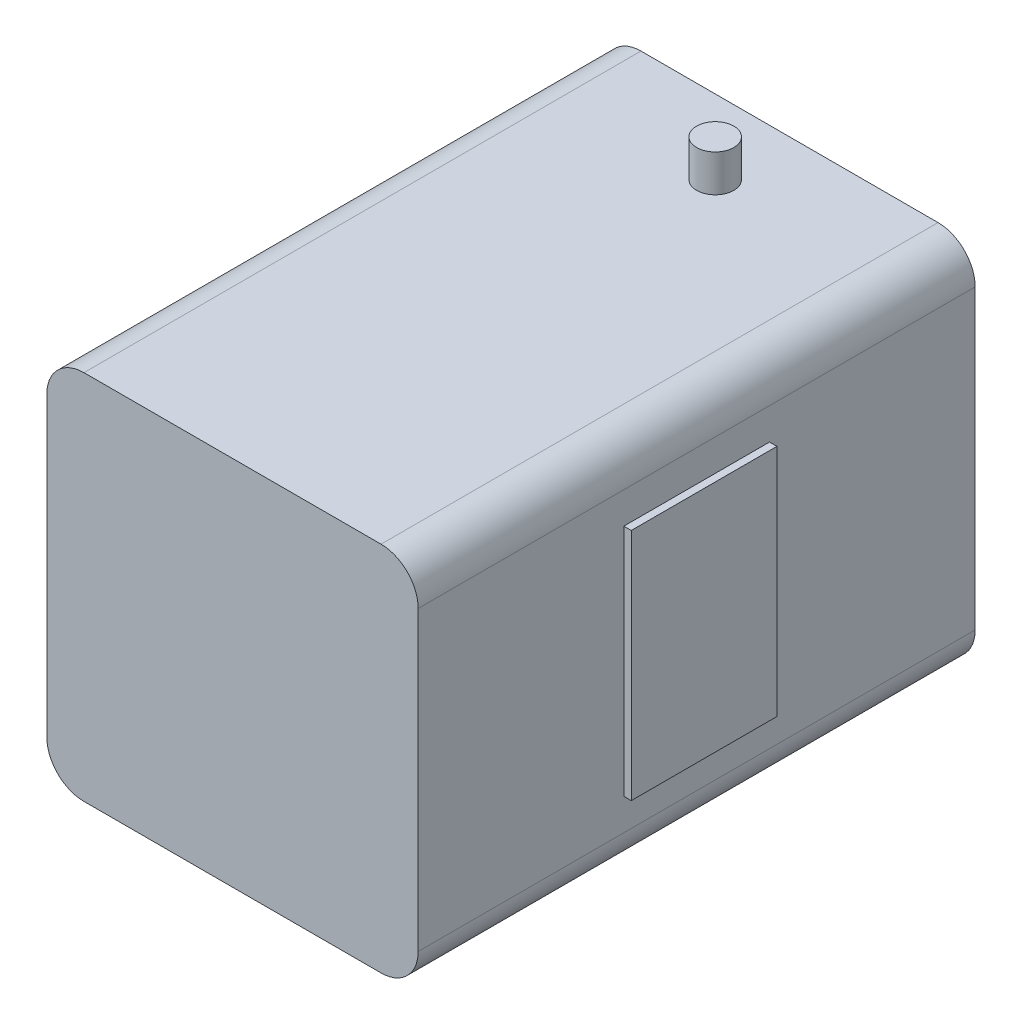
ISO-10303-21;
HEADER;
FILE_DESCRIPTION(('STEP AP214'),'2;1');
FILE_NAME('part.step','',(''),(''),'','','');
FILE_SCHEMA(('AUTOMOTIVE_DESIGN { 1 0 10303 214 1 1 1 1 }'));
ENDSEC;
DATA;
#1=APPLICATION_CONTEXT('core data for automotive mechanical design processes');
#2=APPLICATION_PROTOCOL_DEFINITION('international standard','automotive_design',2000,#1);
#3=PRODUCT_CONTEXT('',#1,'mechanical');
#4=PRODUCT('Part','Part','',(#3));
#5=PRODUCT_RELATED_PRODUCT_CATEGORY('part','',(#4));
#6=PRODUCT_DEFINITION_FORMATION('','',#4);
#7=PRODUCT_DEFINITION_CONTEXT('part definition',#1,'design');
#8=PRODUCT_DEFINITION('design','',#6,#7);
#9=PRODUCT_DEFINITION_SHAPE('','',#8);
#10=(LENGTH_UNIT() NAMED_UNIT(*) SI_UNIT(.MILLI.,.METRE.));
#11=(NAMED_UNIT(*) PLANE_ANGLE_UNIT() SI_UNIT($,.RADIAN.));
#12=(NAMED_UNIT(*) SI_UNIT($,.STERADIAN.) SOLID_ANGLE_UNIT());
#13=UNCERTAINTY_MEASURE_WITH_UNIT(LENGTH_MEASURE(1.E-05),#10,'distance_accuracy_value','');
#14=(GEOMETRIC_REPRESENTATION_CONTEXT(3) GLOBAL_UNCERTAINTY_ASSIGNED_CONTEXT((#13)) GLOBAL_UNIT_ASSIGNED_CONTEXT((#10,
#11,#12)) REPRESENTATION_CONTEXT('',''));
#15=CARTESIAN_POINT('',(0.,0.,0.));
#16=DIRECTION('',(0.,0.,1.));
#17=DIRECTION('',(1.,0.,0.));
#18=AXIS2_PLACEMENT_3D('',#15,#16,#17);
#19=CARTESIAN_POINT('',(50.,-50.,150.));
#20=DIRECTION('',(-1.,0.,0.));
#21=DIRECTION('',(0.,0.,1.));
#22=AXIS2_PLACEMENT_3D('',#19,#20,#21);
#23=PLANE('',#22);
#24=DIRECTION('',(0.,1.,0.));
#25=VECTOR('',#24,1.);
#26=CARTESIAN_POINT('',(50.,-50.,0.));
#27=LINE('',#26,#25);
#28=CARTESIAN_POINT('',(50.,-40.,0.));
#29=VERTEX_POINT('',#28);
#30=CARTESIAN_POINT('',(50.,40.,0.));
#31=VERTEX_POINT('',#30);
#32=EDGE_CURVE('E147',#29,#31,#27,.T.);
#33=ORIENTED_EDGE('',*,*,#32,.T.);
#34=DIRECTION('',(0.,0.,-1.));
#35=VECTOR('',#34,1.);
#36=CARTESIAN_POINT('',(50.,40.,150.));
#37=LINE('',#36,#35);
#38=CARTESIAN_POINT('',(50.,40.,150.));
#39=VERTEX_POINT('',#38);
#40=EDGE_CURVE('E205',#31,#39,#37,.F.);
#41=ORIENTED_EDGE('',*,*,#40,.T.);
#42=DIRECTION('',(0.,1.,0.));
#43=VECTOR('',#42,1.);
#44=CARTESIAN_POINT('',(50.,-50.,150.));
#45=LINE('',#44,#43);
#46=CARTESIAN_POINT('',(50.,-40.,150.));
#47=VERTEX_POINT('',#46);
#48=EDGE_CURVE('E156',#47,#39,#45,.T.);
#49=ORIENTED_EDGE('',*,*,#48,.F.);
#50=DIRECTION('',(0.,0.,-1.));
#51=VECTOR('',#50,1.);
#52=CARTESIAN_POINT('',(50.,-40.,150.));
#53=LINE('',#52,#51);
#54=EDGE_CURVE('E202',#47,#29,#53,.T.);
#55=ORIENTED_EDGE('',*,*,#54,.T.);
#56=EDGE_LOOP('',(#33,#41,#49,#55));
#57=FACE_BOUND('',#56,.T.);
#58=DIRECTION('',(0.,-1.,0.));
#59=VECTOR('',#58,1.);
#60=CARTESIAN_POINT('',(50.,-31.5036686170713,94.6154917804404));
#61=LINE('',#60,#59);
#62=CARTESIAN_POINT('',(50.,31.5036686170713,94.6154917804404));
#63=VERTEX_POINT('',#62);
#64=CARTESIAN_POINT('',(50.,-31.5036686170713,94.6154917804404));
#65=VERTEX_POINT('',#64);
#66=EDGE_CURVE('E146',#63,#65,#61,.T.);
#67=ORIENTED_EDGE('',*,*,#66,.F.);
#68=DIRECTION('',(0.,0.,1.));
#69=VECTOR('',#68,1.);
#70=CARTESIAN_POINT('',(50.,31.5036686170713,55.3845082195596));
#71=LINE('',#70,#69);
#72=CARTESIAN_POINT('',(50.,31.5036686170713,55.3845082195596));
#73=VERTEX_POINT('',#72);
#74=EDGE_CURVE('E143',#73,#63,#71,.T.);
#75=ORIENTED_EDGE('',*,*,#74,.F.);
#76=DIRECTION('',(0.,1.,0.));
#77=VECTOR('',#76,1.);
#78=CARTESIAN_POINT('',(50.,-31.5036686170713,55.3845082195596));
#79=LINE('',#78,#77);
#80=CARTESIAN_POINT('',(50.,-31.5036686170713,55.3845082195596));
#81=VERTEX_POINT('',#80);
#82=EDGE_CURVE('E58',#81,#73,#79,.T.);
#83=ORIENTED_EDGE('',*,*,#82,.F.);
#84=DIRECTION('',(0.,0.,-1.));
#85=VECTOR('',#84,1.);
#86=CARTESIAN_POINT('',(50.,-31.5036686170713,55.3845082195596));
#87=LINE('',#86,#85);
#88=EDGE_CURVE('E53',#65,#81,#87,.T.);
#89=ORIENTED_EDGE('',*,*,#88,.F.);
#90=EDGE_LOOP('',(#67,#75,#83,#89));
#91=FACE_BOUND('',#90,.T.);
#92=ADVANCED_FACE('F37',(#57,#91),#23,.F.);
#93=CARTESIAN_POINT('',(-50.,50.,150.));
#94=DIRECTION('',(0.,-1.,0.));
#95=DIRECTION('',(0.,0.,-1.));
#96=AXIS2_PLACEMENT_3D('',#93,#94,#95);
#97=PLANE('',#96);
#98=CARTESIAN_POINT('',(0.,50.,20.));
#99=DIRECTION('',(0.,-1.,0.));
#100=DIRECTION('',(0.,0.,-1.));
#101=AXIS2_PLACEMENT_3D('',#98,#99,#100);
#102=CIRCLE('',#101,5.);
#103=CARTESIAN_POINT('',(0.,50.,15.));
#104=VERTEX_POINT('',#103);
#105=EDGE_CURVE('E451',#104,#104,#102,.T.);
#106=ORIENTED_EDGE('',*,*,#105,.T.);
#107=EDGE_LOOP('',(#106));
#108=FACE_BOUND('',#107,.T.);
#109=DIRECTION('',(-1.,0.,0.));
#110=VECTOR('',#109,1.);
#111=CARTESIAN_POINT('',(-50.,50.,0.));
#112=LINE('',#111,#110);
#113=CARTESIAN_POINT('',(40.,50.,0.));
#114=VERTEX_POINT('',#113);
#115=CARTESIAN_POINT('',(-40.,50.,0.));
#116=VERTEX_POINT('',#115);
#117=EDGE_CURVE('E150',#114,#116,#112,.T.);
#118=ORIENTED_EDGE('',*,*,#117,.T.);
#119=DIRECTION('',(0.,0.,-1.));
#120=VECTOR('',#119,1.);
#121=CARTESIAN_POINT('',(-40.,50.,150.));
#122=LINE('',#121,#120);
#123=CARTESIAN_POINT('',(-40.,50.,150.));
#124=VERTEX_POINT('',#123);
#125=EDGE_CURVE('E192',#116,#124,#122,.F.);
#126=ORIENTED_EDGE('',*,*,#125,.T.);
#127=DIRECTION('',(-1.,0.,0.));
#128=VECTOR('',#127,1.);
#129=CARTESIAN_POINT('',(-50.,50.,150.));
#130=LINE('',#129,#128);
#131=CARTESIAN_POINT('',(40.,50.,150.));
#132=VERTEX_POINT('',#131);
#133=EDGE_CURVE('E159',#132,#124,#130,.T.);
#134=ORIENTED_EDGE('',*,*,#133,.F.);
#135=DIRECTION('',(0.,0.,-1.));
#136=VECTOR('',#135,1.);
#137=CARTESIAN_POINT('',(40.,50.,150.));
#138=LINE('',#137,#136);
#139=EDGE_CURVE('E189',#132,#114,#138,.T.);
#140=ORIENTED_EDGE('',*,*,#139,.T.);
#141=EDGE_LOOP('',(#118,#126,#134,#140));
#142=FACE_BOUND('',#141,.T.);
#143=ADVANCED_FACE('F236',(#108,#142),#97,.F.);
#144=CARTESIAN_POINT('',(-50.,-50.,150.));
#145=DIRECTION('',(1.,0.,0.));
#146=DIRECTION('',(0.,0.,-1.));
#147=AXIS2_PLACEMENT_3D('',#144,#145,#146);
#148=PLANE('',#147);
#149=DIRECTION('',(0.,-1.,0.));
#150=VECTOR('',#149,1.);
#151=CARTESIAN_POINT('',(-50.,-50.,150.));
#152=LINE('',#151,#150);
#153=CARTESIAN_POINT('',(-50.,40.,150.));
#154=VERTEX_POINT('',#153);
#155=CARTESIAN_POINT('',(-50.,-40.,150.));
#156=VERTEX_POINT('',#155);
#157=EDGE_CURVE('E163',#154,#156,#152,.T.);
#158=ORIENTED_EDGE('',*,*,#157,.F.);
#159=DIRECTION('',(0.,0.,-1.));
#160=VECTOR('',#159,1.);
#161=CARTESIAN_POINT('',(-50.,40.,150.));
#162=LINE('',#161,#160);
#163=CARTESIAN_POINT('',(-50.,40.,0.));
#164=VERTEX_POINT('',#163);
#165=EDGE_CURVE('E178',#154,#164,#162,.T.);
#166=ORIENTED_EDGE('',*,*,#165,.T.);
#167=DIRECTION('',(0.,-1.,0.));
#168=VECTOR('',#167,1.);
#169=CARTESIAN_POINT('',(-50.,-50.,0.));
#170=LINE('',#169,#168);
#171=CARTESIAN_POINT('',(-50.,-40.,0.));
#172=VERTEX_POINT('',#171);
#173=EDGE_CURVE('E172',#164,#172,#170,.T.);
#174=ORIENTED_EDGE('',*,*,#173,.T.);
#175=DIRECTION('',(0.,0.,-1.));
#176=VECTOR('',#175,1.);
#177=CARTESIAN_POINT('',(-50.,-40.,150.));
#178=LINE('',#177,#176);
#179=EDGE_CURVE('E168',#172,#156,#178,.F.);
#180=ORIENTED_EDGE('',*,*,#179,.T.);
#181=EDGE_LOOP('',(#158,#166,#174,#180));
#182=FACE_BOUND('',#181,.T.);
#183=ADVANCED_FACE('F244',(#182),#148,.F.);
#184=CARTESIAN_POINT('',(-50.,-50.,150.));
#185=DIRECTION('',(0.,1.,0.));
#186=DIRECTION('',(0.,0.,1.));
#187=AXIS2_PLACEMENT_3D('',#184,#185,#186);
#188=PLANE('',#187);
#189=CARTESIAN_POINT('',(0.,-50.,20.));
#190=DIRECTION('',(0.,1.,0.));
#191=DIRECTION('',(0.,0.,1.));
#192=AXIS2_PLACEMENT_3D('',#189,#190,#191);
#193=CIRCLE('',#192,5.);
#194=CARTESIAN_POINT('',(0.,-50.,25.));
#195=VERTEX_POINT('',#194);
#196=EDGE_CURVE('E41',#195,#195,#193,.T.);
#197=ORIENTED_EDGE('',*,*,#196,.T.);
#198=EDGE_LOOP('',(#197));
#199=FACE_BOUND('',#198,.T.);
#200=DIRECTION('',(1.,0.,0.));
#201=VECTOR('',#200,1.);
#202=CARTESIAN_POINT('',(-50.,-50.,0.));
#203=LINE('',#202,#201);
#204=CARTESIAN_POINT('',(-40.,-50.,0.));
#205=VERTEX_POINT('',#204);
#206=CARTESIAN_POINT('',(40.,-50.,0.));
#207=VERTEX_POINT('',#206);
#208=EDGE_CURVE('E160',#205,#207,#203,.T.);
#209=ORIENTED_EDGE('',*,*,#208,.T.);
#210=DIRECTION('',(0.,0.,-1.));
#211=VECTOR('',#210,1.);
#212=CARTESIAN_POINT('',(40.,-50.,150.));
#213=LINE('',#212,#211);
#214=CARTESIAN_POINT('',(40.,-50.,150.));
#215=VERTEX_POINT('',#214);
#216=EDGE_CURVE('E11',#207,#215,#213,.F.);
#217=ORIENTED_EDGE('',*,*,#216,.T.);
#218=DIRECTION('',(1.,0.,0.));
#219=VECTOR('',#218,1.);
#220=CARTESIAN_POINT('',(-50.,-50.,150.));
#221=LINE('',#220,#219);
#222=CARTESIAN_POINT('',(-40.,-50.,150.));
#223=VERTEX_POINT('',#222);
#224=EDGE_CURVE('E166',#223,#215,#221,.T.);
#225=ORIENTED_EDGE('',*,*,#224,.F.);
#226=DIRECTION('',(0.,0.,-1.));
#227=VECTOR('',#226,1.);
#228=CARTESIAN_POINT('',(-40.,-50.,150.));
#229=LINE('',#228,#227);
#230=EDGE_CURVE('E46',#223,#205,#229,.T.);
#231=ORIENTED_EDGE('',*,*,#230,.T.);
#232=EDGE_LOOP('',(#209,#217,#225,#231));
#233=FACE_BOUND('',#232,.T.);
#234=ADVANCED_FACE('F212',(#199,#233),#188,.F.);
#235=CARTESIAN_POINT('',(0.,0.,150.));
#236=DIRECTION('',(0.,0.,-1.));
#237=DIRECTION('',(-1.,0.,0.));
#238=AXIS2_PLACEMENT_3D('',#235,#236,#237);
#239=PLANE('',#238);
#240=ORIENTED_EDGE('',*,*,#133,.T.);
#241=CARTESIAN_POINT('',(-40.,40.,150.));
#242=DIRECTION('',(0.,0.,-1.));
#243=DIRECTION('',(-1.,0.,0.));
#244=AXIS2_PLACEMENT_3D('',#241,#242,#243);
#245=CIRCLE('',#244,10.);
#246=EDGE_CURVE('E200',#124,#154,#245,.F.);
#247=ORIENTED_EDGE('',*,*,#246,.T.);
#248=ORIENTED_EDGE('',*,*,#157,.T.);
#249=CARTESIAN_POINT('',(-40.,-40.,150.));
#250=DIRECTION('',(0.,0.,-1.));
#251=DIRECTION('',(-1.,0.,0.));
#252=AXIS2_PLACEMENT_3D('',#249,#250,#251);
#253=CIRCLE('',#252,10.);
#254=EDGE_CURVE('E194',#156,#223,#253,.F.);
#255=ORIENTED_EDGE('',*,*,#254,.T.);
#256=ORIENTED_EDGE('',*,*,#224,.T.);
#257=CARTESIAN_POINT('',(40.,-40.,150.));
#258=DIRECTION('',(0.,0.,-1.));
#259=DIRECTION('',(-1.,0.,0.));
#260=AXIS2_PLACEMENT_3D('',#257,#258,#259);
#261=CIRCLE('',#260,10.);
#262=EDGE_CURVE('E196',#215,#47,#261,.F.);
#263=ORIENTED_EDGE('',*,*,#262,.T.);
#264=ORIENTED_EDGE('',*,*,#48,.T.);
#265=CARTESIAN_POINT('',(40.,40.,150.));
#266=DIRECTION('',(0.,0.,-1.));
#267=DIRECTION('',(-1.,0.,0.));
#268=AXIS2_PLACEMENT_3D('',#265,#266,#267);
#269=CIRCLE('',#268,10.);
#270=EDGE_CURVE('E198',#39,#132,#269,.F.);
#271=ORIENTED_EDGE('',*,*,#270,.T.);
#272=EDGE_LOOP('',(#240,#247,#248,#255,#256,#263,#264,#271));
#273=FACE_BOUND('',#272,.T.);
#274=ADVANCED_FACE('F229',(#273),#239,.F.);
#275=CARTESIAN_POINT('',(0.,0.,0.));
#276=DIRECTION('',(0.,0.,-1.));
#277=DIRECTION('',(-1.,0.,0.));
#278=AXIS2_PLACEMENT_3D('',#275,#276,#277);
#279=PLANE('',#278);
#280=ORIENTED_EDGE('',*,*,#173,.F.);
#281=CARTESIAN_POINT('',(-40.,40.,0.));
#282=DIRECTION('',(0.,0.,-1.));
#283=DIRECTION('',(-1.,0.,0.));
#284=AXIS2_PLACEMENT_3D('',#281,#282,#283);
#285=CIRCLE('',#284,10.);
#286=EDGE_CURVE('E187',#164,#116,#285,.T.);
#287=ORIENTED_EDGE('',*,*,#286,.T.);
#288=ORIENTED_EDGE('',*,*,#117,.F.);
#289=CARTESIAN_POINT('',(40.,40.,0.));
#290=DIRECTION('',(0.,0.,-1.));
#291=DIRECTION('',(-1.,0.,0.));
#292=AXIS2_PLACEMENT_3D('',#289,#290,#291);
#293=CIRCLE('',#292,10.);
#294=EDGE_CURVE('E185',#114,#31,#293,.T.);
#295=ORIENTED_EDGE('',*,*,#294,.T.);
#296=ORIENTED_EDGE('',*,*,#32,.F.);
#297=CARTESIAN_POINT('',(40.,-40.,0.));
#298=DIRECTION('',(0.,0.,-1.));
#299=DIRECTION('',(-1.,0.,0.));
#300=AXIS2_PLACEMENT_3D('',#297,#298,#299);
#301=CIRCLE('',#300,10.);
#302=EDGE_CURVE('E183',#29,#207,#301,.T.);
#303=ORIENTED_EDGE('',*,*,#302,.T.);
#304=ORIENTED_EDGE('',*,*,#208,.F.);
#305=CARTESIAN_POINT('',(-40.,-40.,0.));
#306=DIRECTION('',(0.,0.,-1.));
#307=DIRECTION('',(-1.,0.,0.));
#308=AXIS2_PLACEMENT_3D('',#305,#306,#307);
#309=CIRCLE('',#308,10.);
#310=EDGE_CURVE('E181',#205,#172,#309,.T.);
#311=ORIENTED_EDGE('',*,*,#310,.T.);
#312=EDGE_LOOP('',(#280,#287,#288,#295,#296,#303,#304,#311));
#313=FACE_BOUND('',#312,.T.);
#314=ADVANCED_FACE('F218',(#313),#279,.T.);
#315=CARTESIAN_POINT('',(-40.,40.,150.));
#316=DIRECTION('',(0.,0.,-1.));
#317=DIRECTION('',(-1.,0.,0.));
#318=AXIS2_PLACEMENT_3D('',#315,#316,#317);
#319=CYLINDRICAL_SURFACE('',#318,10.);
#320=ORIENTED_EDGE('',*,*,#246,.F.);
#321=ORIENTED_EDGE('',*,*,#125,.F.);
#322=ORIENTED_EDGE('',*,*,#286,.F.);
#323=ORIENTED_EDGE('',*,*,#165,.F.);
#324=EDGE_LOOP('',(#320,#321,#322,#323));
#325=FACE_BOUND('',#324,.T.);
#326=ADVANCED_FACE('F241',(#325),#319,.T.);
#327=CARTESIAN_POINT('',(40.,40.,150.));
#328=DIRECTION('',(0.,0.,-1.));
#329=DIRECTION('',(-1.,0.,0.));
#330=AXIS2_PLACEMENT_3D('',#327,#328,#329);
#331=CYLINDRICAL_SURFACE('',#330,10.);
#332=ORIENTED_EDGE('',*,*,#270,.F.);
#333=ORIENTED_EDGE('',*,*,#40,.F.);
#334=ORIENTED_EDGE('',*,*,#294,.F.);
#335=ORIENTED_EDGE('',*,*,#139,.F.);
#336=EDGE_LOOP('',(#332,#333,#334,#335));
#337=FACE_BOUND('',#336,.T.);
#338=ADVANCED_FACE('F233',(#337),#331,.T.);
#339=CARTESIAN_POINT('',(40.,-40.,150.));
#340=DIRECTION('',(0.,0.,-1.));
#341=DIRECTION('',(-1.,0.,0.));
#342=AXIS2_PLACEMENT_3D('',#339,#340,#341);
#343=CYLINDRICAL_SURFACE('',#342,10.);
#344=ORIENTED_EDGE('',*,*,#262,.F.);
#345=ORIENTED_EDGE('',*,*,#216,.F.);
#346=ORIENTED_EDGE('',*,*,#302,.F.);
#347=ORIENTED_EDGE('',*,*,#54,.F.);
#348=EDGE_LOOP('',(#344,#345,#346,#347));
#349=FACE_BOUND('',#348,.T.);
#350=ADVANCED_FACE('F223',(#349),#343,.T.);
#351=CARTESIAN_POINT('',(-40.,-40.,150.));
#352=DIRECTION('',(0.,0.,-1.));
#353=DIRECTION('',(-1.,0.,0.));
#354=AXIS2_PLACEMENT_3D('',#351,#352,#353);
#355=CYLINDRICAL_SURFACE('',#354,10.);
#356=ORIENTED_EDGE('',*,*,#254,.F.);
#357=ORIENTED_EDGE('',*,*,#179,.F.);
#358=ORIENTED_EDGE('',*,*,#310,.F.);
#359=ORIENTED_EDGE('',*,*,#230,.F.);
#360=EDGE_LOOP('',(#356,#357,#358,#359));
#361=FACE_BOUND('',#360,.T.);
#362=ADVANCED_FACE('F39',(#361),#355,.T.);
#363=CARTESIAN_POINT('',(52.,-31.5036686170713,94.6154917804404));
#364=DIRECTION('',(0.,0.,-1.));
#365=DIRECTION('',(-1.,0.,0.));
#366=AXIS2_PLACEMENT_3D('',#363,#364,#365);
#367=PLANE('',#366);
#368=ORIENTED_EDGE('',*,*,#66,.T.);
#369=DIRECTION('',(-1.,0.,0.));
#370=VECTOR('',#369,1.);
#371=CARTESIAN_POINT('',(52.,-31.5036686170713,94.6154917804404));
#372=LINE('',#371,#370);
#373=CARTESIAN_POINT('',(52.,-31.5036686170713,94.6154917804404));
#374=VERTEX_POINT('',#373);
#375=EDGE_CURVE('E127',#374,#65,#372,.T.);
#376=ORIENTED_EDGE('',*,*,#375,.F.);
#377=DIRECTION('',(0.,-1.,0.));
#378=VECTOR('',#377,1.);
#379=CARTESIAN_POINT('',(52.,-31.5036686170713,94.6154917804404));
#380=LINE('',#379,#378);
#381=CARTESIAN_POINT('',(52.,31.5036686170713,94.6154917804404));
#382=VERTEX_POINT('',#381);
#383=EDGE_CURVE('E134',#382,#374,#380,.T.);
#384=ORIENTED_EDGE('',*,*,#383,.F.);
#385=DIRECTION('',(-1.,0.,0.));
#386=VECTOR('',#385,1.);
#387=CARTESIAN_POINT('',(52.,31.5036686170713,94.6154917804404));
#388=LINE('',#387,#386);
#389=EDGE_CURVE('E459',#382,#63,#388,.T.);
#390=ORIENTED_EDGE('',*,*,#389,.T.);
#391=EDGE_LOOP('',(#368,#376,#384,#390));
#392=FACE_BOUND('',#391,.T.);
#393=ADVANCED_FACE('F145',(#392),#367,.F.);
#394=CARTESIAN_POINT('',(52.,-31.5036686170713,55.3845082195596));
#395=DIRECTION('',(0.,1.,0.));
#396=DIRECTION('',(0.,0.,1.));
#397=AXIS2_PLACEMENT_3D('',#394,#395,#396);
#398=PLANE('',#397);
#399=ORIENTED_EDGE('',*,*,#88,.T.);
#400=DIRECTION('',(-1.,0.,0.));
#401=VECTOR('',#400,1.);
#402=CARTESIAN_POINT('',(52.,-31.5036686170713,55.3845082195596));
#403=LINE('',#402,#401);
#404=CARTESIAN_POINT('',(52.,-31.5036686170713,55.3845082195596));
#405=VERTEX_POINT('',#404);
#406=EDGE_CURVE('E130',#405,#81,#403,.T.);
#407=ORIENTED_EDGE('',*,*,#406,.F.);
#408=DIRECTION('',(0.,0.,-1.));
#409=VECTOR('',#408,1.);
#410=CARTESIAN_POINT('',(52.,-31.5036686170713,55.3845082195596));
#411=LINE('',#410,#409);
#412=EDGE_CURVE('E123',#374,#405,#411,.T.);
#413=ORIENTED_EDGE('',*,*,#412,.F.);
#414=ORIENTED_EDGE('',*,*,#375,.T.);
#415=EDGE_LOOP('',(#399,#407,#413,#414));
#416=FACE_BOUND('',#415,.T.);
#417=ADVANCED_FACE('F125',(#416),#398,.F.);
#418=CARTESIAN_POINT('',(52.,-31.5036686170713,55.3845082195596));
#419=DIRECTION('',(0.,0.,1.));
#420=DIRECTION('',(1.,0.,0.));
#421=AXIS2_PLACEMENT_3D('',#418,#419,#420);
#422=PLANE('',#421);
#423=ORIENTED_EDGE('',*,*,#82,.T.);
#424=DIRECTION('',(-1.,0.,0.));
#425=VECTOR('',#424,1.);
#426=CARTESIAN_POINT('',(52.,31.5036686170713,55.3845082195596));
#427=LINE('',#426,#425);
#428=CARTESIAN_POINT('',(52.,31.5036686170713,55.3845082195596));
#429=VERTEX_POINT('',#428);
#430=EDGE_CURVE('E152',#429,#73,#427,.T.);
#431=ORIENTED_EDGE('',*,*,#430,.F.);
#432=DIRECTION('',(0.,1.,0.));
#433=VECTOR('',#432,1.);
#434=CARTESIAN_POINT('',(52.,-31.5036686170713,55.3845082195596));
#435=LINE('',#434,#433);
#436=EDGE_CURVE('E133',#405,#429,#435,.T.);
#437=ORIENTED_EDGE('',*,*,#436,.F.);
#438=ORIENTED_EDGE('',*,*,#406,.T.);
#439=EDGE_LOOP('',(#423,#431,#437,#438));
#440=FACE_BOUND('',#439,.T.);
#441=ADVANCED_FACE('F299',(#440),#422,.F.);
#442=CARTESIAN_POINT('',(52.,31.5036686170713,55.3845082195596));
#443=DIRECTION('',(0.,-1.,0.));
#444=DIRECTION('',(0.,0.,-1.));
#445=AXIS2_PLACEMENT_3D('',#442,#443,#444);
#446=PLANE('',#445);
#447=ORIENTED_EDGE('',*,*,#74,.T.);
#448=ORIENTED_EDGE('',*,*,#389,.F.);
#449=DIRECTION('',(0.,0.,1.));
#450=VECTOR('',#449,1.);
#451=CARTESIAN_POINT('',(52.,31.5036686170713,55.3845082195596));
#452=LINE('',#451,#450);
#453=EDGE_CURVE('E139',#429,#382,#452,.T.);
#454=ORIENTED_EDGE('',*,*,#453,.F.);
#455=ORIENTED_EDGE('',*,*,#430,.T.);
#456=EDGE_LOOP('',(#447,#448,#454,#455));
#457=FACE_BOUND('',#456,.T.);
#458=ADVANCED_FACE('F309',(#457),#446,.F.);
#459=CARTESIAN_POINT('',(52.,0.,0.));
#460=DIRECTION('',(1.,0.,0.));
#461=DIRECTION('',(0.,0.,-1.));
#462=AXIS2_PLACEMENT_3D('',#459,#460,#461);
#463=PLANE('',#462);
#464=ORIENTED_EDGE('',*,*,#383,.T.);
#465=ORIENTED_EDGE('',*,*,#412,.T.);
#466=ORIENTED_EDGE('',*,*,#436,.T.);
#467=ORIENTED_EDGE('',*,*,#453,.T.);
#468=EDGE_LOOP('',(#464,#465,#466,#467));
#469=FACE_BOUND('',#468,.T.);
#470=ADVANCED_FACE('F137',(#469),#463,.T.);
#471=CARTESIAN_POINT('',(0.,-60.,20.));
#472=DIRECTION('',(0.,-1.,0.));
#473=DIRECTION('',(0.,0.,-1.));
#474=AXIS2_PLACEMENT_3D('',#471,#472,#473);
#475=PLANE('',#474);
#476=CARTESIAN_POINT('',(0.,-60.,20.));
#477=DIRECTION('',(0.,-1.,0.));
#478=DIRECTION('',(0.,0.,-1.));
#479=AXIS2_PLACEMENT_3D('',#476,#477,#478);
#480=CIRCLE('',#479,5.);
#481=CARTESIAN_POINT('',(0.,-60.,15.));
#482=VERTEX_POINT('',#481);
#483=EDGE_CURVE('E448',#482,#482,#480,.T.);
#484=ORIENTED_EDGE('',*,*,#483,.T.);
#485=EDGE_LOOP('',(#484));
#486=FACE_BOUND('',#485,.T.);
#487=ADVANCED_FACE('F330',(#486),#475,.T.);
#488=CARTESIAN_POINT('',(0.,60.,20.));
#489=DIRECTION('',(0.,-1.,0.));
#490=DIRECTION('',(0.,0.,-1.));
#491=AXIS2_PLACEMENT_3D('',#488,#489,#490);
#492=CYLINDRICAL_SURFACE('',#491,5.);
#493=ORIENTED_EDGE('',*,*,#483,.F.);
#494=EDGE_LOOP('',(#493));
#495=FACE_BOUND('',#494,.T.);
#496=ORIENTED_EDGE('',*,*,#196,.F.);
#497=EDGE_LOOP('',(#496));
#498=FACE_BOUND('',#497,.T.);
#499=ADVANCED_FACE('F361',(#495,#498),#492,.T.);
#500=CARTESIAN_POINT('',(0.,60.,20.));
#501=DIRECTION('',(0.,-1.,0.));
#502=DIRECTION('',(0.,0.,-1.));
#503=AXIS2_PLACEMENT_3D('',#500,#501,#502);
#504=CIRCLE('',#503,5.);
#505=CARTESIAN_POINT('',(0.,60.,15.));
#506=VERTEX_POINT('',#505);
#507=EDGE_CURVE('E447',#506,#506,#504,.T.);
#508=ORIENTED_EDGE('',*,*,#507,.T.);
#509=EDGE_LOOP('',(#508));
#510=FACE_BOUND('',#509,.T.);
#511=ORIENTED_EDGE('',*,*,#105,.F.);
#512=EDGE_LOOP('',(#511));
#513=FACE_BOUND('',#512,.T.);
#514=ADVANCED_FACE('F372',(#510,#513),#492,.T.);
#515=CARTESIAN_POINT('',(0.,60.,20.));
#516=DIRECTION('',(0.,-1.,0.));
#517=DIRECTION('',(0.,0.,-1.));
#518=AXIS2_PLACEMENT_3D('',#515,#516,#517);
#519=PLANE('',#518);
#520=ORIENTED_EDGE('',*,*,#507,.F.);
#521=EDGE_LOOP('',(#520));
#522=FACE_BOUND('',#521,.T.);
#523=ADVANCED_FACE('F383',(#522),#519,.F.);
#524=CLOSED_SHELL('',(#92,#143,#183,#234,#274,#314,#326,#338,#350,#362,#393,#417,#441,#458,#470,
#487,#499,#514,#523));
#525=MANIFOLD_SOLID_BREP('B2',#524);
#526=ADVANCED_BREP_SHAPE_REPRESENTATION('',(#18,#525),#14);
#527=SHAPE_DEFINITION_REPRESENTATION(#9,#526);
ENDSEC;
END-ISO-10303-21;
